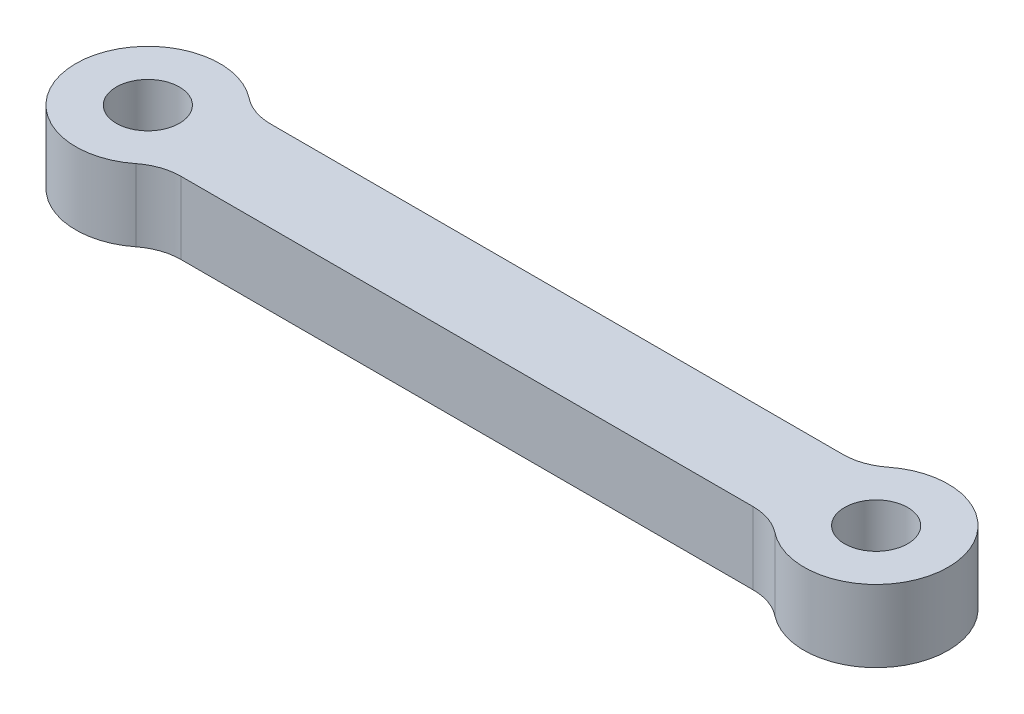
ISO-10303-21;
HEADER;
FILE_DESCRIPTION(('STEP AP214'),'2;1');
FILE_NAME('part.step','',(''),(''),'','','');
FILE_SCHEMA(('AUTOMOTIVE_DESIGN { 1 0 10303 214 1 1 1 1 }'));
ENDSEC;
DATA;
#1=APPLICATION_CONTEXT('core data for automotive mechanical design processes');
#2=APPLICATION_PROTOCOL_DEFINITION('international standard','automotive_design',2000,#1);
#3=PRODUCT_CONTEXT('',#1,'mechanical');
#4=PRODUCT('Part','Part','',(#3));
#5=PRODUCT_RELATED_PRODUCT_CATEGORY('part','',(#4));
#6=PRODUCT_DEFINITION_FORMATION('','',#4);
#7=PRODUCT_DEFINITION_CONTEXT('part definition',#1,'design');
#8=PRODUCT_DEFINITION('design','',#6,#7);
#9=PRODUCT_DEFINITION_SHAPE('','',#8);
#10=(LENGTH_UNIT() NAMED_UNIT(*) SI_UNIT(.MILLI.,.METRE.));
#11=(NAMED_UNIT(*) PLANE_ANGLE_UNIT() SI_UNIT($,.RADIAN.));
#12=(NAMED_UNIT(*) SI_UNIT($,.STERADIAN.) SOLID_ANGLE_UNIT());
#13=UNCERTAINTY_MEASURE_WITH_UNIT(LENGTH_MEASURE(1.E-05),#10,'distance_accuracy_value','');
#14=(GEOMETRIC_REPRESENTATION_CONTEXT(3) GLOBAL_UNCERTAINTY_ASSIGNED_CONTEXT((#13)) GLOBAL_UNIT_ASSIGNED_CONTEXT((#10,
#11,#12)) REPRESENTATION_CONTEXT('',''));
#15=CARTESIAN_POINT('',(0.,0.,0.));
#16=DIRECTION('',(0.,0.,1.));
#17=DIRECTION('',(1.,0.,0.));
#18=AXIS2_PLACEMENT_3D('',#15,#16,#17);
#19=CARTESIAN_POINT('',(40.4099999989222,4.,0.));
#20=DIRECTION('',(0.,-1.,0.));
#21=DIRECTION('',(0.,0.,-1.));
#22=AXIS2_PLACEMENT_3D('',#19,#20,#21);
#23=CYLINDRICAL_SURFACE('',#22,4.);
#24=CARTESIAN_POINT('',(40.4099999989222,0.,0.));
#25=DIRECTION('',(0.,-1.,0.));
#26=DIRECTION('',(0.,0.,-1.));
#27=AXIS2_PLACEMENT_3D('',#24,#25,#26);
#28=CIRCLE('',#27,4.);
#29=CARTESIAN_POINT('',(37.9356417023952,0.,-3.14285714285714));
#30=VERTEX_POINT('',#29);
#31=CARTESIAN_POINT('',(37.9356417023952,0.,3.14285714285714));
#32=VERTEX_POINT('',#31);
#33=EDGE_CURVE('E132',#30,#32,#28,.T.);
#34=ORIENTED_EDGE('',*,*,#33,.F.);
#35=DIRECTION('',(0.,-1.,0.));
#36=VECTOR('',#35,1.);
#37=CARTESIAN_POINT('',(37.9356417023952,4.,-3.14285714285714));
#38=LINE('',#37,#36);
#39=CARTESIAN_POINT('',(37.9356417023952,4.,-3.14285714285714));
#40=VERTEX_POINT('',#39);
#41=EDGE_CURVE('E11',#40,#30,#38,.T.);
#42=ORIENTED_EDGE('',*,*,#41,.F.);
#43=CARTESIAN_POINT('',(40.4099999989222,4.,0.));
#44=DIRECTION('',(0.,-1.,0.));
#45=DIRECTION('',(0.,0.,-1.));
#46=AXIS2_PLACEMENT_3D('',#43,#44,#45);
#47=CIRCLE('',#46,4.);
#48=CARTESIAN_POINT('',(37.9356417023952,4.,3.14285714285714));
#49=VERTEX_POINT('',#48);
#50=EDGE_CURVE('E153',#40,#49,#47,.T.);
#51=ORIENTED_EDGE('',*,*,#50,.T.);
#52=DIRECTION('',(0.,-1.,0.));
#53=VECTOR('',#52,1.);
#54=CARTESIAN_POINT('',(37.9356417023952,4.,3.14285714285714));
#55=LINE('',#54,#53);
#56=EDGE_CURVE('E38',#49,#32,#55,.T.);
#57=ORIENTED_EDGE('',*,*,#56,.T.);
#58=EDGE_LOOP('',(#34,#42,#51,#57));
#59=FACE_BOUND('',#58,.T.);
#60=ADVANCED_FACE('F35',(#59),#23,.T.);
#61=CARTESIAN_POINT('',(36.07987298,4.,-5.5));
#62=DIRECTION('',(0.,-1.,0.));
#63=DIRECTION('',(0.,0.,-1.));
#64=AXIS2_PLACEMENT_3D('',#61,#62,#63);
#65=CYLINDRICAL_SURFACE('',#64,3.);
#66=CARTESIAN_POINT('',(36.07987298,0.,-5.5));
#67=DIRECTION('',(0.,1.,0.));
#68=DIRECTION('',(0.,0.,1.));
#69=AXIS2_PLACEMENT_3D('',#66,#67,#68);
#70=CIRCLE('',#69,3.);
#71=CARTESIAN_POINT('',(36.07987298,0.,-2.5));
#72=VERTEX_POINT('',#71);
#73=EDGE_CURVE('E151',#72,#30,#70,.T.);
#74=ORIENTED_EDGE('',*,*,#73,.F.);
#75=DIRECTION('',(0.,-1.,0.));
#76=VECTOR('',#75,1.);
#77=CARTESIAN_POINT('',(36.07987298,4.,-2.5));
#78=LINE('',#77,#76);
#79=CARTESIAN_POINT('',(36.07987298,4.,-2.5));
#80=VERTEX_POINT('',#79);
#81=EDGE_CURVE('E44',#80,#72,#78,.T.);
#82=ORIENTED_EDGE('',*,*,#81,.F.);
#83=CARTESIAN_POINT('',(36.07987298,4.,-5.5));
#84=DIRECTION('',(0.,1.,0.));
#85=DIRECTION('',(0.,0.,1.));
#86=AXIS2_PLACEMENT_3D('',#83,#84,#85);
#87=CIRCLE('',#86,3.);
#88=EDGE_CURVE('E122',#80,#40,#87,.T.);
#89=ORIENTED_EDGE('',*,*,#88,.T.);
#90=ORIENTED_EDGE('',*,*,#41,.T.);
#91=EDGE_LOOP('',(#74,#82,#89,#90));
#92=FACE_BOUND('',#91,.T.);
#93=ADVANCED_FACE('F165',(#92),#65,.F.);
#94=CARTESIAN_POINT('',(4.3301270189222,4.,-2.5));
#95=DIRECTION('',(0.,0.,-1.));
#96=DIRECTION('',(-1.,0.,0.));
#97=AXIS2_PLACEMENT_3D('',#94,#95,#96);
#98=PLANE('',#97);
#99=DIRECTION('',(1.,0.,0.));
#100=VECTOR('',#99,1.);
#101=CARTESIAN_POINT('',(4.3301270189222,0.,-2.5));
#102=LINE('',#101,#100);
#103=CARTESIAN_POINT('',(4.3301270189222,0.,-2.5));
#104=VERTEX_POINT('',#103);
#105=EDGE_CURVE('E109',#104,#72,#102,.T.);
#106=ORIENTED_EDGE('',*,*,#105,.F.);
#107=DIRECTION('',(0.,-1.,0.));
#108=VECTOR('',#107,1.);
#109=CARTESIAN_POINT('',(4.3301270189222,4.,-2.5));
#110=LINE('',#109,#108);
#111=CARTESIAN_POINT('',(4.3301270189222,4.,-2.5));
#112=VERTEX_POINT('',#111);
#113=EDGE_CURVE('E104',#112,#104,#110,.T.);
#114=ORIENTED_EDGE('',*,*,#113,.F.);
#115=DIRECTION('',(1.,0.,0.));
#116=VECTOR('',#115,1.);
#117=CARTESIAN_POINT('',(4.3301270189222,4.,-2.5));
#118=LINE('',#117,#116);
#119=EDGE_CURVE('E107',#112,#80,#118,.T.);
#120=ORIENTED_EDGE('',*,*,#119,.T.);
#121=ORIENTED_EDGE('',*,*,#81,.T.);
#122=EDGE_LOOP('',(#106,#114,#120,#121));
#123=FACE_BOUND('',#122,.T.);
#124=ADVANCED_FACE('F106',(#123),#98,.T.);
#125=CARTESIAN_POINT('',(4.3301270189222,4.,-5.5));
#126=DIRECTION('',(0.,-1.,0.));
#127=DIRECTION('',(0.,0.,-1.));
#128=AXIS2_PLACEMENT_3D('',#125,#126,#127);
#129=CYLINDRICAL_SURFACE('',#128,3.);
#130=CARTESIAN_POINT('',(4.3301270189222,0.,-5.5));
#131=DIRECTION('',(0.,1.,0.));
#132=DIRECTION('',(0.,0.,1.));
#133=AXIS2_PLACEMENT_3D('',#130,#131,#132);
#134=CIRCLE('',#133,3.);
#135=CARTESIAN_POINT('',(2.47435829652697,0.,-3.14285714285714));
#136=VERTEX_POINT('',#135);
#137=EDGE_CURVE('E148',#136,#104,#134,.T.);
#138=ORIENTED_EDGE('',*,*,#137,.F.);
#139=DIRECTION('',(0.,-1.,0.));
#140=VECTOR('',#139,1.);
#141=CARTESIAN_POINT('',(2.47435829652697,4.,-3.14285714285714));
#142=LINE('',#141,#140);
#143=CARTESIAN_POINT('',(2.47435829652697,4.,-3.14285714285714));
#144=VERTEX_POINT('',#143);
#145=EDGE_CURVE('E114',#144,#136,#142,.T.);
#146=ORIENTED_EDGE('',*,*,#145,.F.);
#147=CARTESIAN_POINT('',(4.3301270189222,4.,-5.5));
#148=DIRECTION('',(0.,1.,0.));
#149=DIRECTION('',(0.,0.,1.));
#150=AXIS2_PLACEMENT_3D('',#147,#148,#149);
#151=CIRCLE('',#150,3.);
#152=EDGE_CURVE('E120',#144,#112,#151,.T.);
#153=ORIENTED_EDGE('',*,*,#152,.T.);
#154=ORIENTED_EDGE('',*,*,#113,.T.);
#155=EDGE_LOOP('',(#138,#146,#153,#154));
#156=FACE_BOUND('',#155,.T.);
#157=ADVANCED_FACE('F124',(#156),#129,.F.);
#158=CARTESIAN_POINT('',(0.,4.,0.));
#159=DIRECTION('',(0.,-1.,0.));
#160=DIRECTION('',(0.,0.,-1.));
#161=AXIS2_PLACEMENT_3D('',#158,#159,#160);
#162=CYLINDRICAL_SURFACE('',#161,4.);
#163=CARTESIAN_POINT('',(0.,0.,0.));
#164=DIRECTION('',(0.,-1.,0.));
#165=DIRECTION('',(0.,0.,-1.));
#166=AXIS2_PLACEMENT_3D('',#163,#164,#165);
#167=CIRCLE('',#166,4.);
#168=CARTESIAN_POINT('',(2.47435829652697,0.,3.14285714285714));
#169=VERTEX_POINT('',#168);
#170=EDGE_CURVE('E145',#169,#136,#167,.T.);
#171=ORIENTED_EDGE('',*,*,#170,.F.);
#172=DIRECTION('',(0.,-1.,0.));
#173=VECTOR('',#172,1.);
#174=CARTESIAN_POINT('',(2.47435829652697,4.,3.14285714285714));
#175=LINE('',#174,#173);
#176=CARTESIAN_POINT('',(2.47435829652697,4.,3.14285714285714));
#177=VERTEX_POINT('',#176);
#178=EDGE_CURVE('E157',#177,#169,#175,.T.);
#179=ORIENTED_EDGE('',*,*,#178,.F.);
#180=CARTESIAN_POINT('',(0.,4.,0.));
#181=DIRECTION('',(0.,-1.,0.));
#182=DIRECTION('',(0.,0.,-1.));
#183=AXIS2_PLACEMENT_3D('',#180,#181,#182);
#184=CIRCLE('',#183,4.);
#185=EDGE_CURVE('E125',#177,#144,#184,.T.);
#186=ORIENTED_EDGE('',*,*,#185,.T.);
#187=ORIENTED_EDGE('',*,*,#145,.T.);
#188=EDGE_LOOP('',(#171,#179,#186,#187));
#189=FACE_BOUND('',#188,.T.);
#190=ADVANCED_FACE('F178',(#189),#162,.T.);
#191=CARTESIAN_POINT('',(4.3301270189222,4.,5.5));
#192=DIRECTION('',(0.,-1.,0.));
#193=DIRECTION('',(0.,0.,-1.));
#194=AXIS2_PLACEMENT_3D('',#191,#192,#193);
#195=CYLINDRICAL_SURFACE('',#194,3.);
#196=CARTESIAN_POINT('',(4.3301270189222,0.,5.5));
#197=DIRECTION('',(0.,1.,0.));
#198=DIRECTION('',(0.,0.,1.));
#199=AXIS2_PLACEMENT_3D('',#196,#197,#198);
#200=CIRCLE('',#199,3.);
#201=CARTESIAN_POINT('',(4.3301270189222,0.,2.5));
#202=VERTEX_POINT('',#201);
#203=EDGE_CURVE('E142',#202,#169,#200,.T.);
#204=ORIENTED_EDGE('',*,*,#203,.F.);
#205=DIRECTION('',(0.,-1.,0.));
#206=VECTOR('',#205,1.);
#207=CARTESIAN_POINT('',(4.3301270189222,4.,2.5));
#208=LINE('',#207,#206);
#209=CARTESIAN_POINT('',(4.3301270189222,4.,2.5));
#210=VERTEX_POINT('',#209);
#211=EDGE_CURVE('E159',#210,#202,#208,.T.);
#212=ORIENTED_EDGE('',*,*,#211,.F.);
#213=CARTESIAN_POINT('',(4.3301270189222,4.,5.5));
#214=DIRECTION('',(0.,1.,0.));
#215=DIRECTION('',(0.,0.,1.));
#216=AXIS2_PLACEMENT_3D('',#213,#214,#215);
#217=CIRCLE('',#216,3.);
#218=EDGE_CURVE('E127',#210,#177,#217,.T.);
#219=ORIENTED_EDGE('',*,*,#218,.T.);
#220=ORIENTED_EDGE('',*,*,#178,.T.);
#221=EDGE_LOOP('',(#204,#212,#219,#220));
#222=FACE_BOUND('',#221,.T.);
#223=ADVANCED_FACE('F181',(#222),#195,.F.);
#224=CARTESIAN_POINT('',(36.07987298,4.,2.5));
#225=DIRECTION('',(0.,0.,1.));
#226=DIRECTION('',(1.,0.,0.));
#227=AXIS2_PLACEMENT_3D('',#224,#225,#226);
#228=PLANE('',#227);
#229=DIRECTION('',(-1.,0.,0.));
#230=VECTOR('',#229,1.);
#231=CARTESIAN_POINT('',(36.07987298,0.,2.5));
#232=LINE('',#231,#230);
#233=CARTESIAN_POINT('',(36.07987298,0.,2.5));
#234=VERTEX_POINT('',#233);
#235=EDGE_CURVE('E139',#234,#202,#232,.T.);
#236=ORIENTED_EDGE('',*,*,#235,.F.);
#237=DIRECTION('',(0.,-1.,0.));
#238=VECTOR('',#237,1.);
#239=CARTESIAN_POINT('',(36.07987298,4.,2.5));
#240=LINE('',#239,#238);
#241=CARTESIAN_POINT('',(36.07987298,4.,2.5));
#242=VERTEX_POINT('',#241);
#243=EDGE_CURVE('E160',#242,#234,#240,.T.);
#244=ORIENTED_EDGE('',*,*,#243,.F.);
#245=DIRECTION('',(-1.,0.,0.));
#246=VECTOR('',#245,1.);
#247=CARTESIAN_POINT('',(36.07987298,4.,2.5));
#248=LINE('',#247,#246);
#249=EDGE_CURVE('E227',#242,#210,#248,.T.);
#250=ORIENTED_EDGE('',*,*,#249,.T.);
#251=ORIENTED_EDGE('',*,*,#211,.T.);
#252=EDGE_LOOP('',(#236,#244,#250,#251));
#253=FACE_BOUND('',#252,.T.);
#254=ADVANCED_FACE('F185',(#253),#228,.T.);
#255=CARTESIAN_POINT('',(36.07987298,4.,5.5));
#256=DIRECTION('',(0.,-1.,0.));
#257=DIRECTION('',(0.,0.,-1.));
#258=AXIS2_PLACEMENT_3D('',#255,#256,#257);
#259=CYLINDRICAL_SURFACE('',#258,3.);
#260=CARTESIAN_POINT('',(36.07987298,0.,5.5));
#261=DIRECTION('',(0.,1.,0.));
#262=DIRECTION('',(0.,0.,1.));
#263=AXIS2_PLACEMENT_3D('',#260,#261,#262);
#264=CIRCLE('',#263,3.);
#265=EDGE_CURVE('E135',#32,#234,#264,.T.);
#266=ORIENTED_EDGE('',*,*,#265,.F.);
#267=ORIENTED_EDGE('',*,*,#56,.F.);
#268=CARTESIAN_POINT('',(36.07987298,4.,5.5));
#269=DIRECTION('',(0.,1.,0.));
#270=DIRECTION('',(0.,0.,1.));
#271=AXIS2_PLACEMENT_3D('',#268,#269,#270);
#272=CIRCLE('',#271,3.);
#273=EDGE_CURVE('E225',#49,#242,#272,.T.);
#274=ORIENTED_EDGE('',*,*,#273,.T.);
#275=ORIENTED_EDGE('',*,*,#243,.T.);
#276=EDGE_LOOP('',(#266,#267,#274,#275));
#277=FACE_BOUND('',#276,.T.);
#278=ADVANCED_FACE('F162',(#277),#259,.F.);
#279=CARTESIAN_POINT('',(40.4099999989222,4.,0.));
#280=DIRECTION('',(0.,-1.,0.));
#281=DIRECTION('',(0.,0.,-1.));
#282=AXIS2_PLACEMENT_3D('',#279,#280,#281);
#283=PLANE('',#282);
#284=CARTESIAN_POINT('',(0.,4.,0.));
#285=DIRECTION('',(0.,-1.,0.));
#286=DIRECTION('',(0.,0.,1.));
#287=AXIS2_PLACEMENT_3D('',#284,#285,#286);
#288=CIRCLE('',#287,1.75);
#289=CARTESIAN_POINT('',(0.,4.,1.75));
#290=VERTEX_POINT('',#289);
#291=EDGE_CURVE('E212',#290,#290,#288,.T.);
#292=ORIENTED_EDGE('',*,*,#291,.T.);
#293=EDGE_LOOP('',(#292));
#294=FACE_BOUND('',#293,.T.);
#295=CARTESIAN_POINT('',(40.4099999989222,4.,0.));
#296=DIRECTION('',(0.,-1.,0.));
#297=DIRECTION('',(0.,0.,1.));
#298=AXIS2_PLACEMENT_3D('',#295,#296,#297);
#299=CIRCLE('',#298,1.75);
#300=CARTESIAN_POINT('',(40.4099999989222,4.,1.75));
#301=VERTEX_POINT('',#300);
#302=EDGE_CURVE('E136',#301,#301,#299,.T.);
#303=ORIENTED_EDGE('',*,*,#302,.T.);
#304=EDGE_LOOP('',(#303));
#305=FACE_BOUND('',#304,.T.);
#306=ORIENTED_EDGE('',*,*,#50,.F.);
#307=ORIENTED_EDGE('',*,*,#88,.F.);
#308=ORIENTED_EDGE('',*,*,#119,.F.);
#309=ORIENTED_EDGE('',*,*,#152,.F.);
#310=ORIENTED_EDGE('',*,*,#185,.F.);
#311=ORIENTED_EDGE('',*,*,#218,.F.);
#312=ORIENTED_EDGE('',*,*,#249,.F.);
#313=ORIENTED_EDGE('',*,*,#273,.F.);
#314=EDGE_LOOP('',(#306,#307,#308,#309,#310,#311,#312,#313));
#315=FACE_BOUND('',#314,.T.);
#316=ADVANCED_FACE('F118',(#294,#305,#315),#283,.F.);
#317=CARTESIAN_POINT('',(40.4099999989222,0.,0.));
#318=DIRECTION('',(0.,-1.,0.));
#319=DIRECTION('',(0.,0.,-1.));
#320=AXIS2_PLACEMENT_3D('',#317,#318,#319);
#321=PLANE('',#320);
#322=CARTESIAN_POINT('',(0.,0.,0.));
#323=DIRECTION('',(0.,-1.,0.));
#324=DIRECTION('',(0.,0.,1.));
#325=AXIS2_PLACEMENT_3D('',#322,#323,#324);
#326=CIRCLE('',#325,1.75);
#327=CARTESIAN_POINT('',(0.,0.,1.75));
#328=VERTEX_POINT('',#327);
#329=EDGE_CURVE('E215',#328,#328,#326,.T.);
#330=ORIENTED_EDGE('',*,*,#329,.F.);
#331=EDGE_LOOP('',(#330));
#332=FACE_BOUND('',#331,.T.);
#333=CARTESIAN_POINT('',(40.4099999989222,0.,0.));
#334=DIRECTION('',(0.,-1.,0.));
#335=DIRECTION('',(0.,0.,1.));
#336=AXIS2_PLACEMENT_3D('',#333,#334,#335);
#337=CIRCLE('',#336,1.75);
#338=CARTESIAN_POINT('',(40.4099999989222,0.,1.75));
#339=VERTEX_POINT('',#338);
#340=EDGE_CURVE('E217',#339,#339,#337,.T.);
#341=ORIENTED_EDGE('',*,*,#340,.F.);
#342=EDGE_LOOP('',(#341));
#343=FACE_BOUND('',#342,.T.);
#344=ORIENTED_EDGE('',*,*,#33,.T.);
#345=ORIENTED_EDGE('',*,*,#265,.T.);
#346=ORIENTED_EDGE('',*,*,#235,.T.);
#347=ORIENTED_EDGE('',*,*,#203,.T.);
#348=ORIENTED_EDGE('',*,*,#170,.T.);
#349=ORIENTED_EDGE('',*,*,#137,.T.);
#350=ORIENTED_EDGE('',*,*,#105,.T.);
#351=ORIENTED_EDGE('',*,*,#73,.T.);
#352=EDGE_LOOP('',(#344,#345,#346,#347,#348,#349,#350,#351));
#353=FACE_BOUND('',#352,.T.);
#354=ADVANCED_FACE('F164',(#332,#343,#353),#321,.T.);
#355=CARTESIAN_POINT('',(40.4099999989222,4.,0.));
#356=DIRECTION('',(0.,-1.,0.));
#357=DIRECTION('',(0.,0.,-1.));
#358=AXIS2_PLACEMENT_3D('',#355,#356,#357);
#359=CYLINDRICAL_SURFACE('',#358,1.75);
#360=ORIENTED_EDGE('',*,*,#302,.F.);
#361=EDGE_LOOP('',(#360));
#362=FACE_BOUND('',#361,.T.);
#363=ORIENTED_EDGE('',*,*,#340,.T.);
#364=EDGE_LOOP('',(#363));
#365=FACE_BOUND('',#364,.T.);
#366=ADVANCED_FACE('F197',(#362,#365),#359,.F.);
#367=CARTESIAN_POINT('',(0.,4.,0.));
#368=DIRECTION('',(0.,-1.,0.));
#369=DIRECTION('',(0.,0.,-1.));
#370=AXIS2_PLACEMENT_3D('',#367,#368,#369);
#371=CYLINDRICAL_SURFACE('',#370,1.75);
#372=ORIENTED_EDGE('',*,*,#291,.F.);
#373=EDGE_LOOP('',(#372));
#374=FACE_BOUND('',#373,.T.);
#375=ORIENTED_EDGE('',*,*,#329,.T.);
#376=EDGE_LOOP('',(#375));
#377=FACE_BOUND('',#376,.T.);
#378=ADVANCED_FACE('F204',(#374,#377),#371,.F.);
#379=CLOSED_SHELL('',(#60,#93,#124,#157,#190,#223,#254,#278,#316,#354,#366,#378));
#380=MANIFOLD_SOLID_BREP('B2',#379);
#381=ADVANCED_BREP_SHAPE_REPRESENTATION('',(#18,#380),#14);
#382=SHAPE_DEFINITION_REPRESENTATION(#9,#381);
ENDSEC;
END-ISO-10303-21;
